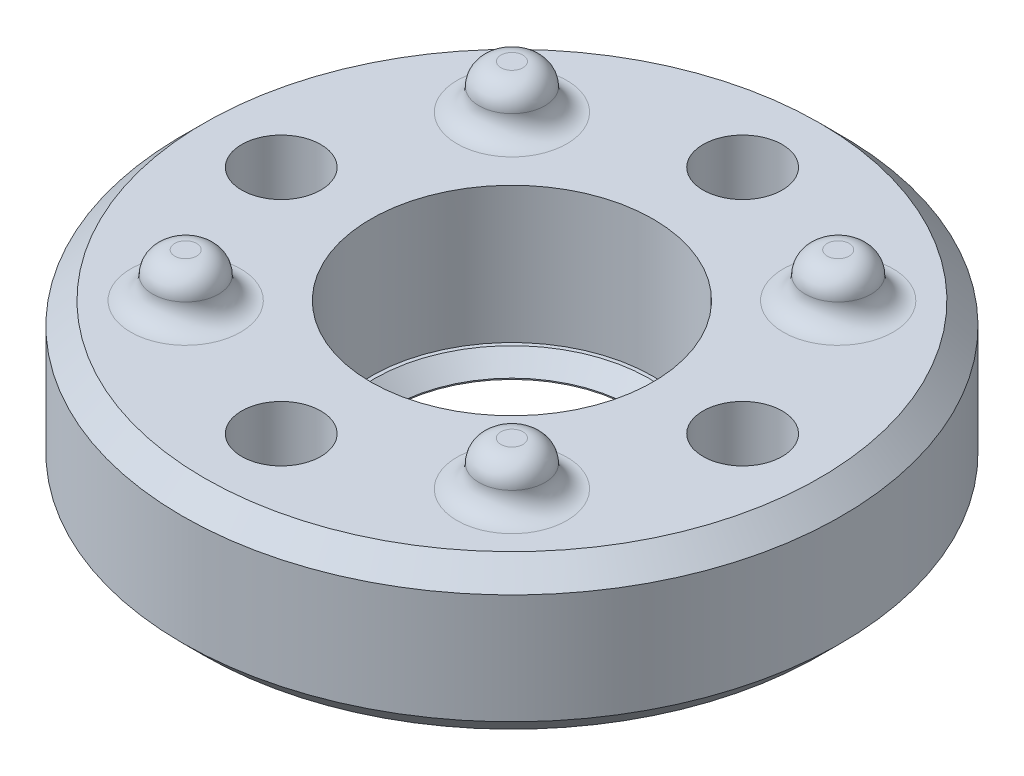
ISO-10303-21;
HEADER;
FILE_DESCRIPTION(('STEP AP214'),'2;1');
FILE_NAME('part.step','',(''),(''),'','','');
FILE_SCHEMA(('AUTOMOTIVE_DESIGN { 1 0 10303 214 1 1 1 1 }'));
ENDSEC;
DATA;
#1=APPLICATION_CONTEXT('core data for automotive mechanical design processes');
#2=APPLICATION_PROTOCOL_DEFINITION('international standard','automotive_design',2000,#1);
#3=PRODUCT_CONTEXT('',#1,'mechanical');
#4=PRODUCT('Part','Part','',(#3));
#5=PRODUCT_RELATED_PRODUCT_CATEGORY('part','',(#4));
#6=PRODUCT_DEFINITION_FORMATION('','',#4);
#7=PRODUCT_DEFINITION_CONTEXT('part definition',#1,'design');
#8=PRODUCT_DEFINITION('design','',#6,#7);
#9=PRODUCT_DEFINITION_SHAPE('','',#8);
#10=(LENGTH_UNIT() NAMED_UNIT(*) SI_UNIT(.MILLI.,.METRE.));
#11=(NAMED_UNIT(*) PLANE_ANGLE_UNIT() SI_UNIT($,.RADIAN.));
#12=(NAMED_UNIT(*) SI_UNIT($,.STERADIAN.) SOLID_ANGLE_UNIT());
#13=UNCERTAINTY_MEASURE_WITH_UNIT(LENGTH_MEASURE(1.E-05),#10,'distance_accuracy_value','');
#14=(GEOMETRIC_REPRESENTATION_CONTEXT(3) GLOBAL_UNCERTAINTY_ASSIGNED_CONTEXT((#13)) GLOBAL_UNIT_ASSIGNED_CONTEXT((#10,
#11,#12)) REPRESENTATION_CONTEXT('',''));
#15=CARTESIAN_POINT('',(0.,0.,0.));
#16=DIRECTION('',(0.,0.,1.));
#17=DIRECTION('',(1.,0.,0.));
#18=AXIS2_PLACEMENT_3D('',#15,#16,#17);
#19=CARTESIAN_POINT('',(0.,7.,0.));
#20=DIRECTION('',(0.,-1.,0.));
#21=DIRECTION('',(0.,0.,-1.));
#22=AXIS2_PLACEMENT_3D('',#19,#20,#21);
#23=CYLINDRICAL_SURFACE('',#22,6.425);
#24=CARTESIAN_POINT('',(0.,7.,0.));
#25=DIRECTION('',(0.,1.,0.));
#26=DIRECTION('',(0.,0.,1.));
#27=AXIS2_PLACEMENT_3D('',#24,#25,#26);
#28=CIRCLE('',#27,6.425);
#29=CARTESIAN_POINT('',(0.,7.,6.425));
#30=VERTEX_POINT('',#29);
#31=EDGE_CURVE('E148',#30,#30,#28,.T.);
#32=ORIENTED_EDGE('',*,*,#31,.T.);
#33=EDGE_LOOP('',(#32));
#34=FACE_BOUND('',#33,.T.);
#35=CARTESIAN_POINT('',(0.,0.8,0.));
#36=DIRECTION('',(0.,-1.,0.));
#37=DIRECTION('',(0.,0.,-1.));
#38=AXIS2_PLACEMENT_3D('',#35,#36,#37);
#39=CIRCLE('',#38,6.425);
#40=CARTESIAN_POINT('',(0.,0.8,-6.425));
#41=VERTEX_POINT('',#40);
#42=EDGE_CURVE('E67',#41,#41,#39,.T.);
#43=ORIENTED_EDGE('',*,*,#42,.T.);
#44=EDGE_LOOP('',(#43));
#45=FACE_BOUND('',#44,.T.);
#46=ADVANCED_FACE('F45',(#34,#45),#23,.F.);
#47=CARTESIAN_POINT('',(-10.5,7.,0.));
#48=DIRECTION('',(0.,-1.,0.));
#49=DIRECTION('',(0.,0.,-1.));
#50=AXIS2_PLACEMENT_3D('',#47,#48,#49);
#51=CYLINDRICAL_SURFACE('',#50,1.8);
#52=CARTESIAN_POINT('',(-10.5,7.,0.));
#53=DIRECTION('',(0.,-1.,0.));
#54=DIRECTION('',(0.,0.,-1.));
#55=AXIS2_PLACEMENT_3D('',#52,#53,#54);
#56=CIRCLE('',#55,1.8);
#57=CARTESIAN_POINT('',(-10.5,7.,-1.8));
#58=VERTEX_POINT('',#57);
#59=EDGE_CURVE('E153',#58,#58,#56,.T.);
#60=ORIENTED_EDGE('',*,*,#59,.F.);
#61=EDGE_LOOP('',(#60));
#62=FACE_BOUND('',#61,.T.);
#63=CARTESIAN_POINT('',(-10.5,2.,0.));
#64=DIRECTION('',(0.,-1.,0.));
#65=DIRECTION('',(0.,0.,-1.));
#66=AXIS2_PLACEMENT_3D('',#63,#64,#65);
#67=CIRCLE('',#66,1.8);
#68=CARTESIAN_POINT('',(-10.5,2.,-1.8));
#69=VERTEX_POINT('',#68);
#70=EDGE_CURVE('E149',#69,#69,#67,.F.);
#71=ORIENTED_EDGE('',*,*,#70,.F.);
#72=EDGE_LOOP('',(#71));
#73=FACE_BOUND('',#72,.T.);
#74=ADVANCED_FACE('F224',(#62,#73),#51,.F.);
#75=CARTESIAN_POINT('',(0.,7.,-10.5));
#76=DIRECTION('',(0.,-1.,0.));
#77=DIRECTION('',(0.,0.,-1.));
#78=AXIS2_PLACEMENT_3D('',#75,#76,#77);
#79=CYLINDRICAL_SURFACE('',#78,1.8);
#80=CARTESIAN_POINT('',(0.,7.,-10.5));
#81=DIRECTION('',(0.,-1.,0.));
#82=DIRECTION('',(0.,0.,-1.));
#83=AXIS2_PLACEMENT_3D('',#80,#81,#82);
#84=CIRCLE('',#83,1.8);
#85=CARTESIAN_POINT('',(0.,7.,-12.3));
#86=VERTEX_POINT('',#85);
#87=EDGE_CURVE('E174',#86,#86,#84,.T.);
#88=ORIENTED_EDGE('',*,*,#87,.F.);
#89=EDGE_LOOP('',(#88));
#90=FACE_BOUND('',#89,.T.);
#91=CARTESIAN_POINT('',(0.,2.,-10.5));
#92=DIRECTION('',(0.,-1.,0.));
#93=DIRECTION('',(0.,0.,-1.));
#94=AXIS2_PLACEMENT_3D('',#91,#92,#93);
#95=CIRCLE('',#94,1.8);
#96=CARTESIAN_POINT('',(0.,2.,-12.3));
#97=VERTEX_POINT('',#96);
#98=EDGE_CURVE('E154',#97,#97,#95,.F.);
#99=ORIENTED_EDGE('',*,*,#98,.F.);
#100=EDGE_LOOP('',(#99));
#101=FACE_BOUND('',#100,.T.);
#102=ADVANCED_FACE('F231',(#90,#101),#79,.F.);
#103=CARTESIAN_POINT('',(10.5,7.,0.));
#104=DIRECTION('',(0.,-1.,0.));
#105=DIRECTION('',(0.,0.,-1.));
#106=AXIS2_PLACEMENT_3D('',#103,#104,#105);
#107=CYLINDRICAL_SURFACE('',#106,1.8);
#108=CARTESIAN_POINT('',(10.5,7.,0.));
#109=DIRECTION('',(0.,-1.,0.));
#110=DIRECTION('',(0.,0.,-1.));
#111=AXIS2_PLACEMENT_3D('',#108,#109,#110);
#112=CIRCLE('',#111,1.8);
#113=CARTESIAN_POINT('',(10.5,7.,-1.8));
#114=VERTEX_POINT('',#113);
#115=EDGE_CURVE('E178',#114,#114,#112,.T.);
#116=ORIENTED_EDGE('',*,*,#115,.F.);
#117=EDGE_LOOP('',(#116));
#118=FACE_BOUND('',#117,.T.);
#119=CARTESIAN_POINT('',(10.5,2.,0.));
#120=DIRECTION('',(0.,-1.,0.));
#121=DIRECTION('',(0.,0.,-1.));
#122=AXIS2_PLACEMENT_3D('',#119,#120,#121);
#123=CIRCLE('',#122,1.8);
#124=CARTESIAN_POINT('',(10.5,2.,-1.8));
#125=VERTEX_POINT('',#124);
#126=EDGE_CURVE('E158',#125,#125,#123,.F.);
#127=ORIENTED_EDGE('',*,*,#126,.F.);
#128=EDGE_LOOP('',(#127));
#129=FACE_BOUND('',#128,.T.);
#130=ADVANCED_FACE('F238',(#118,#129),#107,.F.);
#131=CARTESIAN_POINT('',(0.,7.,10.5));
#132=DIRECTION('',(0.,-1.,0.));
#133=DIRECTION('',(0.,0.,-1.));
#134=AXIS2_PLACEMENT_3D('',#131,#132,#133);
#135=CYLINDRICAL_SURFACE('',#134,1.8);
#136=CARTESIAN_POINT('',(0.,7.,10.5));
#137=DIRECTION('',(0.,-1.,0.));
#138=DIRECTION('',(0.,0.,-1.));
#139=AXIS2_PLACEMENT_3D('',#136,#137,#138);
#140=CIRCLE('',#139,1.8);
#141=CARTESIAN_POINT('',(0.,7.,8.7));
#142=VERTEX_POINT('',#141);
#143=EDGE_CURVE('E170',#142,#142,#140,.T.);
#144=ORIENTED_EDGE('',*,*,#143,.F.);
#145=EDGE_LOOP('',(#144));
#146=FACE_BOUND('',#145,.T.);
#147=CARTESIAN_POINT('',(0.,2.,10.5));
#148=DIRECTION('',(0.,-1.,0.));
#149=DIRECTION('',(0.,0.,-1.));
#150=AXIS2_PLACEMENT_3D('',#147,#148,#149);
#151=CIRCLE('',#150,1.8);
#152=CARTESIAN_POINT('',(0.,2.,8.7));
#153=VERTEX_POINT('',#152);
#154=EDGE_CURVE('E162',#153,#153,#151,.F.);
#155=ORIENTED_EDGE('',*,*,#154,.F.);
#156=EDGE_LOOP('',(#155));
#157=FACE_BOUND('',#156,.T.);
#158=ADVANCED_FACE('F220',(#146,#157),#135,.F.);
#159=CARTESIAN_POINT('',(0.,7.,0.));
#160=DIRECTION('',(0.,1.,0.));
#161=DIRECTION('',(0.,0.,1.));
#162=AXIS2_PLACEMENT_3D('',#159,#160,#161);
#163=PLANE('',#162);
#164=CARTESIAN_POINT('',(-7.42462120245875,7.,-7.42462120245875));
#165=DIRECTION('',(0.,1.,0.));
#166=DIRECTION('',(0.,0.,1.));
#167=AXIS2_PLACEMENT_3D('',#164,#165,#166);
#168=CIRCLE('',#167,2.5);
#169=CARTESIAN_POINT('',(-7.42462120245875,7.,-4.92462120245875));
#170=VERTEX_POINT('',#169);
#171=EDGE_CURVE('E59',#170,#170,#168,.F.);
#172=ORIENTED_EDGE('',*,*,#171,.T.);
#173=EDGE_LOOP('',(#172));
#174=FACE_BOUND('',#173,.T.);
#175=CARTESIAN_POINT('',(-7.42462120245875,7.,7.42462120245875));
#176=DIRECTION('',(0.,1.,0.));
#177=DIRECTION('',(0.,0.,1.));
#178=AXIS2_PLACEMENT_3D('',#175,#176,#177);
#179=CIRCLE('',#178,2.5);
#180=CARTESIAN_POINT('',(-7.42462120245875,7.,9.92462120245875));
#181=VERTEX_POINT('',#180);
#182=EDGE_CURVE('E64',#181,#181,#179,.F.);
#183=ORIENTED_EDGE('',*,*,#182,.T.);
#184=EDGE_LOOP('',(#183));
#185=FACE_BOUND('',#184,.T.);
#186=CARTESIAN_POINT('',(7.42462120245875,7.,-7.42462120245875));
#187=DIRECTION('',(0.,1.,0.));
#188=DIRECTION('',(0.,0.,1.));
#189=AXIS2_PLACEMENT_3D('',#186,#187,#188);
#190=CIRCLE('',#189,2.5);
#191=CARTESIAN_POINT('',(7.42462120245875,7.,-4.92462120245875));
#192=VERTEX_POINT('',#191);
#193=EDGE_CURVE('E92',#192,#192,#190,.F.);
#194=ORIENTED_EDGE('',*,*,#193,.T.);
#195=EDGE_LOOP('',(#194));
#196=FACE_BOUND('',#195,.T.);
#197=CARTESIAN_POINT('',(7.42462120245875,7.,7.42462120245875));
#198=DIRECTION('',(0.,1.,0.));
#199=DIRECTION('',(0.,0.,1.));
#200=AXIS2_PLACEMENT_3D('',#197,#198,#199);
#201=CIRCLE('',#200,2.5);
#202=CARTESIAN_POINT('',(7.42462120245875,7.,9.92462120245875));
#203=VERTEX_POINT('',#202);
#204=EDGE_CURVE('E96',#203,#203,#201,.F.);
#205=ORIENTED_EDGE('',*,*,#204,.T.);
#206=EDGE_LOOP('',(#205));
#207=FACE_BOUND('',#206,.T.);
#208=CARTESIAN_POINT('',(0.,7.,0.));
#209=DIRECTION('',(0.,1.,0.));
#210=DIRECTION('',(0.,0.,1.));
#211=AXIS2_PLACEMENT_3D('',#208,#209,#210);
#212=CIRCLE('',#211,14.);
#213=CARTESIAN_POINT('',(0.,7.,14.));
#214=VERTEX_POINT('',#213);
#215=EDGE_CURVE('E128',#214,#214,#212,.T.);
#216=ORIENTED_EDGE('',*,*,#215,.T.);
#217=EDGE_LOOP('',(#216));
#218=FACE_BOUND('',#217,.T.);
#219=ORIENTED_EDGE('',*,*,#143,.T.);
#220=EDGE_LOOP('',(#219));
#221=FACE_BOUND('',#220,.T.);
#222=ORIENTED_EDGE('',*,*,#115,.T.);
#223=EDGE_LOOP('',(#222));
#224=FACE_BOUND('',#223,.T.);
#225=ORIENTED_EDGE('',*,*,#87,.T.);
#226=EDGE_LOOP('',(#225));
#227=FACE_BOUND('',#226,.T.);
#228=ORIENTED_EDGE('',*,*,#59,.T.);
#229=EDGE_LOOP('',(#228));
#230=FACE_BOUND('',#229,.T.);
#231=ORIENTED_EDGE('',*,*,#31,.F.);
#232=EDGE_LOOP('',(#231));
#233=FACE_BOUND('',#232,.T.);
#234=ADVANCED_FACE('F208',(#174,#185,#196,#207,#218,#221,#224,#227,#230,#233),#163,.T.);
#235=CARTESIAN_POINT('',(0.,0.,0.));
#236=DIRECTION('',(0.,1.,0.));
#237=DIRECTION('',(0.,0.,1.));
#238=AXIS2_PLACEMENT_3D('',#235,#236,#237);
#239=PLANE('',#238);
#240=CARTESIAN_POINT('',(0.,0.,0.));
#241=DIRECTION('',(0.,1.,0.));
#242=DIRECTION('',(0.,0.,1.));
#243=AXIS2_PLACEMENT_3D('',#240,#241,#242);
#244=CIRCLE('',#243,14.);
#245=CARTESIAN_POINT('',(0.,0.,14.));
#246=VERTEX_POINT('',#245);
#247=EDGE_CURVE('E116',#246,#246,#244,.F.);
#248=ORIENTED_EDGE('',*,*,#247,.T.);
#249=EDGE_LOOP('',(#248));
#250=FACE_BOUND('',#249,.T.);
#251=CARTESIAN_POINT('',(0.,0.,10.5));
#252=DIRECTION('',(0.,-1.,0.));
#253=DIRECTION('',(0.,0.,-1.));
#254=AXIS2_PLACEMENT_3D('',#251,#252,#253);
#255=CIRCLE('',#254,3.25);
#256=CARTESIAN_POINT('',(0.,0.,7.25));
#257=VERTEX_POINT('',#256);
#258=EDGE_CURVE('E166',#257,#257,#255,.T.);
#259=ORIENTED_EDGE('',*,*,#258,.F.);
#260=EDGE_LOOP('',(#259));
#261=FACE_BOUND('',#260,.T.);
#262=CARTESIAN_POINT('',(10.5,0.,0.));
#263=DIRECTION('',(0.,-1.,0.));
#264=DIRECTION('',(0.,0.,-1.));
#265=AXIS2_PLACEMENT_3D('',#262,#263,#264);
#266=CIRCLE('',#265,3.25000000000005);
#267=CARTESIAN_POINT('',(10.5,0.,-3.25000000000005));
#268=VERTEX_POINT('',#267);
#269=EDGE_CURVE('E192',#268,#268,#266,.T.);
#270=ORIENTED_EDGE('',*,*,#269,.F.);
#271=EDGE_LOOP('',(#270));
#272=FACE_BOUND('',#271,.T.);
#273=CARTESIAN_POINT('',(0.,0.,-10.5));
#274=DIRECTION('',(0.,-1.,0.));
#275=DIRECTION('',(0.,0.,-1.));
#276=AXIS2_PLACEMENT_3D('',#273,#274,#275);
#277=CIRCLE('',#276,3.25);
#278=CARTESIAN_POINT('',(0.,0.,-13.75));
#279=VERTEX_POINT('',#278);
#280=EDGE_CURVE('E188',#279,#279,#277,.T.);
#281=ORIENTED_EDGE('',*,*,#280,.F.);
#282=EDGE_LOOP('',(#281));
#283=FACE_BOUND('',#282,.T.);
#284=CARTESIAN_POINT('',(-10.5,0.,0.));
#285=DIRECTION('',(0.,-1.,0.));
#286=DIRECTION('',(0.,0.,-1.));
#287=AXIS2_PLACEMENT_3D('',#284,#285,#286);
#288=CIRCLE('',#287,3.25);
#289=CARTESIAN_POINT('',(-10.5,0.,-3.25));
#290=VERTEX_POINT('',#289);
#291=EDGE_CURVE('E87',#290,#290,#288,.T.);
#292=ORIENTED_EDGE('',*,*,#291,.F.);
#293=EDGE_LOOP('',(#292));
#294=FACE_BOUND('',#293,.T.);
#295=CARTESIAN_POINT('',(0.,0.,0.));
#296=DIRECTION('',(0.,-1.,0.));
#297=DIRECTION('',(0.,0.,-1.));
#298=AXIS2_PLACEMENT_3D('',#295,#296,#297);
#299=CIRCLE('',#298,5.5);
#300=CARTESIAN_POINT('',(0.,0.,-5.5));
#301=VERTEX_POINT('',#300);
#302=EDGE_CURVE('E72',#301,#301,#299,.T.);
#303=ORIENTED_EDGE('',*,*,#302,.F.);
#304=EDGE_LOOP('',(#303));
#305=FACE_BOUND('',#304,.T.);
#306=ADVANCED_FACE('F205',(#250,#261,#272,#283,#294,#305),#239,.F.);
#307=CARTESIAN_POINT('',(0.,7.,0.));
#308=DIRECTION('',(0.,-1.,0.));
#309=DIRECTION('',(0.,0.,-1.));
#310=AXIS2_PLACEMENT_3D('',#307,#308,#309);
#311=CYLINDRICAL_SURFACE('',#310,15.);
#312=CARTESIAN_POINT('',(0.,1.00000000000001,0.));
#313=DIRECTION('',(0.,1.,0.));
#314=DIRECTION('',(0.,0.,1.));
#315=AXIS2_PLACEMENT_3D('',#312,#313,#314);
#316=CIRCLE('',#315,15.);
#317=CARTESIAN_POINT('',(0.,1.00000000000001,15.));
#318=VERTEX_POINT('',#317);
#319=EDGE_CURVE('E120',#318,#318,#316,.T.);
#320=ORIENTED_EDGE('',*,*,#319,.T.);
#321=EDGE_LOOP('',(#320));
#322=FACE_BOUND('',#321,.T.);
#323=CARTESIAN_POINT('',(0.,6.,0.));
#324=DIRECTION('',(0.,1.,0.));
#325=DIRECTION('',(0.,0.,1.));
#326=AXIS2_PLACEMENT_3D('',#323,#324,#325);
#327=CIRCLE('',#326,15.);
#328=CARTESIAN_POINT('',(0.,6.,15.));
#329=VERTEX_POINT('',#328);
#330=EDGE_CURVE('E124',#329,#329,#327,.F.);
#331=ORIENTED_EDGE('',*,*,#330,.T.);
#332=EDGE_LOOP('',(#331));
#333=FACE_BOUND('',#332,.T.);
#334=ADVANCED_FACE('F207',(#322,#333),#311,.T.);
#335=CARTESIAN_POINT('',(0.,2.,10.5));
#336=DIRECTION('',(0.,-1.,0.));
#337=DIRECTION('',(0.,0.,-1.));
#338=AXIS2_PLACEMENT_3D('',#335,#336,#337);
#339=CYLINDRICAL_SURFACE('',#338,3.25);
#340=CARTESIAN_POINT('',(0.,0.500833564943505,10.5));
#341=DIRECTION('',(0.,1.,0.));
#342=DIRECTION('',(0.,0.,1.));
#343=AXIS2_PLACEMENT_3D('',#340,#341,#342);
#344=CIRCLE('',#343,3.25);
#345=CARTESIAN_POINT('',(0.,0.500833564943505,13.75));
#346=VERTEX_POINT('',#345);
#347=EDGE_CURVE('E132',#346,#346,#344,.T.);
#348=ORIENTED_EDGE('',*,*,#347,.T.);
#349=EDGE_LOOP('',(#348));
#350=FACE_BOUND('',#349,.T.);
#351=ORIENTED_EDGE('',*,*,#258,.T.);
#352=EDGE_LOOP('',(#351));
#353=FACE_BOUND('',#352,.T.);
#354=ADVANCED_FACE('F216',(#350,#353),#339,.F.);
#355=CARTESIAN_POINT('',(10.5,2.,0.));
#356=DIRECTION('',(0.,-1.,0.));
#357=DIRECTION('',(0.,0.,-1.));
#358=AXIS2_PLACEMENT_3D('',#355,#356,#357);
#359=CYLINDRICAL_SURFACE('',#358,3.25000000000005);
#360=CARTESIAN_POINT('',(10.5,0.500833564943503,0.));
#361=DIRECTION('',(0.,1.,0.));
#362=DIRECTION('',(0.,0.,1.));
#363=AXIS2_PLACEMENT_3D('',#360,#361,#362);
#364=CIRCLE('',#363,3.25000000000005);
#365=CARTESIAN_POINT('',(10.5,0.500833564943503,3.25000000000005));
#366=VERTEX_POINT('',#365);
#367=EDGE_CURVE('E136',#366,#366,#364,.T.);
#368=ORIENTED_EDGE('',*,*,#367,.T.);
#369=EDGE_LOOP('',(#368));
#370=FACE_BOUND('',#369,.T.);
#371=ORIENTED_EDGE('',*,*,#269,.T.);
#372=EDGE_LOOP('',(#371));
#373=FACE_BOUND('',#372,.T.);
#374=ADVANCED_FACE('F254',(#370,#373),#359,.F.);
#375=CARTESIAN_POINT('',(0.,2.,-10.5));
#376=DIRECTION('',(0.,-1.,0.));
#377=DIRECTION('',(0.,0.,-1.));
#378=AXIS2_PLACEMENT_3D('',#375,#376,#377);
#379=CYLINDRICAL_SURFACE('',#378,3.25);
#380=CARTESIAN_POINT('',(0.,0.500833564943505,-10.5));
#381=DIRECTION('',(0.,1.,0.));
#382=DIRECTION('',(0.,0.,1.));
#383=AXIS2_PLACEMENT_3D('',#380,#381,#382);
#384=CIRCLE('',#383,3.25);
#385=CARTESIAN_POINT('',(0.,0.500833564943505,-7.25));
#386=VERTEX_POINT('',#385);
#387=EDGE_CURVE('E140',#386,#386,#384,.T.);
#388=ORIENTED_EDGE('',*,*,#387,.T.);
#389=EDGE_LOOP('',(#388));
#390=FACE_BOUND('',#389,.T.);
#391=ORIENTED_EDGE('',*,*,#280,.T.);
#392=EDGE_LOOP('',(#391));
#393=FACE_BOUND('',#392,.T.);
#394=ADVANCED_FACE('F250',(#390,#393),#379,.F.);
#395=CARTESIAN_POINT('',(-10.5,2.,0.));
#396=DIRECTION('',(0.,-1.,0.));
#397=DIRECTION('',(0.,0.,-1.));
#398=AXIS2_PLACEMENT_3D('',#395,#396,#397);
#399=CYLINDRICAL_SURFACE('',#398,3.25);
#400=CARTESIAN_POINT('',(-10.5,0.500833564943505,0.));
#401=DIRECTION('',(0.,1.,0.));
#402=DIRECTION('',(0.,0.,1.));
#403=AXIS2_PLACEMENT_3D('',#400,#401,#402);
#404=CIRCLE('',#403,3.25);
#405=CARTESIAN_POINT('',(-10.5,0.500833564943505,3.25));
#406=VERTEX_POINT('',#405);
#407=EDGE_CURVE('E144',#406,#406,#404,.T.);
#408=ORIENTED_EDGE('',*,*,#407,.T.);
#409=EDGE_LOOP('',(#408));
#410=FACE_BOUND('',#409,.T.);
#411=ORIENTED_EDGE('',*,*,#291,.T.);
#412=EDGE_LOOP('',(#411));
#413=FACE_BOUND('',#412,.T.);
#414=ADVANCED_FACE('F246',(#410,#413),#399,.F.);
#415=CARTESIAN_POINT('',(-10.5,0.500833564943505,0.));
#416=DIRECTION('',(0.,1.,0.));
#417=DIRECTION('',(0.,0.,1.));
#418=AXIS2_PLACEMENT_3D('',#415,#416,#417);
#419=TOROIDAL_SURFACE('',#418,1.75,1.5);
#420=ORIENTED_EDGE('',*,*,#407,.F.);
#421=EDGE_LOOP('',(#420));
#422=FACE_BOUND('',#421,.T.);
#423=ORIENTED_EDGE('',*,*,#70,.T.);
#424=EDGE_LOOP('',(#423));
#425=FACE_BOUND('',#424,.T.);
#426=ADVANCED_FACE('F249',(#422,#425),#419,.F.);
#427=CARTESIAN_POINT('',(0.,0.500833564943505,-10.5));
#428=DIRECTION('',(0.,1.,0.));
#429=DIRECTION('',(0.,0.,1.));
#430=AXIS2_PLACEMENT_3D('',#427,#428,#429);
#431=TOROIDAL_SURFACE('',#430,1.75,1.5);
#432=ORIENTED_EDGE('',*,*,#387,.F.);
#433=EDGE_LOOP('',(#432));
#434=FACE_BOUND('',#433,.T.);
#435=ORIENTED_EDGE('',*,*,#98,.T.);
#436=EDGE_LOOP('',(#435));
#437=FACE_BOUND('',#436,.T.);
#438=ADVANCED_FACE('F453',(#434,#437),#431,.F.);
#439=CARTESIAN_POINT('',(10.5,0.500833564943503,0.));
#440=DIRECTION('',(0.,1.,0.));
#441=DIRECTION('',(0.,0.,1.));
#442=AXIS2_PLACEMENT_3D('',#439,#440,#441);
#443=TOROIDAL_SURFACE('',#442,1.75000000000005,1.5);
#444=ORIENTED_EDGE('',*,*,#367,.F.);
#445=EDGE_LOOP('',(#444));
#446=FACE_BOUND('',#445,.T.);
#447=ORIENTED_EDGE('',*,*,#126,.T.);
#448=EDGE_LOOP('',(#447));
#449=FACE_BOUND('',#448,.T.);
#450=ADVANCED_FACE('F443',(#446,#449),#443,.F.);
#451=CARTESIAN_POINT('',(0.,0.500833564943505,10.5));
#452=DIRECTION('',(0.,1.,0.));
#453=DIRECTION('',(0.,0.,1.));
#454=AXIS2_PLACEMENT_3D('',#451,#452,#453);
#455=TOROIDAL_SURFACE('',#454,1.75,1.5);
#456=ORIENTED_EDGE('',*,*,#347,.F.);
#457=EDGE_LOOP('',(#456));
#458=FACE_BOUND('',#457,.T.);
#459=ORIENTED_EDGE('',*,*,#154,.T.);
#460=EDGE_LOOP('',(#459));
#461=FACE_BOUND('',#460,.T.);
#462=ADVANCED_FACE('F433',(#458,#461),#455,.F.);
#463=CARTESIAN_POINT('',(0.,7.,0.));
#464=DIRECTION('',(0.,-1.,0.));
#465=DIRECTION('',(0.,0.,-1.));
#466=AXIS2_PLACEMENT_3D('',#463,#464,#465);
#467=CONICAL_SURFACE('',#466,14.,0.785398163397447);
#468=ORIENTED_EDGE('',*,*,#330,.F.);
#469=EDGE_LOOP('',(#468));
#470=FACE_BOUND('',#469,.T.);
#471=ORIENTED_EDGE('',*,*,#215,.F.);
#472=EDGE_LOOP('',(#471));
#473=FACE_BOUND('',#472,.T.);
#474=ADVANCED_FACE('F423',(#470,#473),#467,.T.);
#475=CARTESIAN_POINT('',(0.,1.00000000000001,0.));
#476=DIRECTION('',(0.,1.,0.));
#477=DIRECTION('',(0.,0.,1.));
#478=AXIS2_PLACEMENT_3D('',#475,#476,#477);
#479=CONICAL_SURFACE('',#478,15.,0.785398163397448);
#480=ORIENTED_EDGE('',*,*,#247,.F.);
#481=EDGE_LOOP('',(#480));
#482=FACE_BOUND('',#481,.T.);
#483=ORIENTED_EDGE('',*,*,#319,.F.);
#484=EDGE_LOOP('',(#483));
#485=FACE_BOUND('',#484,.T.);
#486=ADVANCED_FACE('F266',(#482,#485),#479,.T.);
#487=CARTESIAN_POINT('',(7.42462120245875,9.,-7.42462120245875));
#488=DIRECTION('',(0.,1.,0.));
#489=DIRECTION('',(0.,0.,1.));
#490=AXIS2_PLACEMENT_3D('',#487,#488,#489);
#491=PLANE('',#490);
#492=CARTESIAN_POINT('',(7.42462120245875,9.,-7.42462120245875));
#493=DIRECTION('',(0.,1.,0.));
#494=DIRECTION('',(0.,0.,1.));
#495=AXIS2_PLACEMENT_3D('',#492,#493,#494);
#496=CIRCLE('',#495,0.500000000000001);
#497=CARTESIAN_POINT('',(7.42462120245875,9.,-6.92462120245875));
#498=VERTEX_POINT('',#497);
#499=EDGE_CURVE('E108',#498,#498,#496,.T.);
#500=ORIENTED_EDGE('',*,*,#499,.T.);
#501=EDGE_LOOP('',(#500));
#502=FACE_BOUND('',#501,.T.);
#503=ADVANCED_FACE('F262',(#502),#491,.T.);
#504=CARTESIAN_POINT('',(7.42462120245875,9.,7.42462120245875));
#505=DIRECTION('',(0.,1.,0.));
#506=DIRECTION('',(0.,0.,1.));
#507=AXIS2_PLACEMENT_3D('',#504,#505,#506);
#508=PLANE('',#507);
#509=CARTESIAN_POINT('',(7.42462120245875,9.,7.42462120245875));
#510=DIRECTION('',(0.,1.,0.));
#511=DIRECTION('',(0.,0.,1.));
#512=AXIS2_PLACEMENT_3D('',#509,#510,#511);
#513=CIRCLE('',#512,0.500000000000002);
#514=CARTESIAN_POINT('',(7.42462120245875,9.,7.92462120245875));
#515=VERTEX_POINT('',#514);
#516=EDGE_CURVE('E112',#515,#515,#513,.T.);
#517=ORIENTED_EDGE('',*,*,#516,.T.);
#518=EDGE_LOOP('',(#517));
#519=FACE_BOUND('',#518,.T.);
#520=ADVANCED_FACE('F265',(#519),#508,.T.);
#521=CARTESIAN_POINT('',(-7.42462120245875,9.,7.42462120245875));
#522=DIRECTION('',(0.,1.,0.));
#523=DIRECTION('',(0.,0.,1.));
#524=AXIS2_PLACEMENT_3D('',#521,#522,#523);
#525=PLANE('',#524);
#526=CARTESIAN_POINT('',(-7.42462120245875,9.,7.42462120245875));
#527=DIRECTION('',(0.,1.,0.));
#528=DIRECTION('',(0.,0.,1.));
#529=AXIS2_PLACEMENT_3D('',#526,#527,#528);
#530=CIRCLE('',#529,0.499999999999999);
#531=CARTESIAN_POINT('',(-7.42462120245875,9.,7.92462120245875));
#532=VERTEX_POINT('',#531);
#533=EDGE_CURVE('E104',#532,#532,#530,.T.);
#534=ORIENTED_EDGE('',*,*,#533,.T.);
#535=EDGE_LOOP('',(#534));
#536=FACE_BOUND('',#535,.T.);
#537=ADVANCED_FACE('F270',(#536),#525,.T.);
#538=CARTESIAN_POINT('',(-7.42462120245875,9.,-7.42462120245875));
#539=DIRECTION('',(0.,1.,0.));
#540=DIRECTION('',(0.,0.,1.));
#541=AXIS2_PLACEMENT_3D('',#538,#539,#540);
#542=PLANE('',#541);
#543=CARTESIAN_POINT('',(-7.42462120245875,9.,-7.42462120245875));
#544=DIRECTION('',(0.,1.,0.));
#545=DIRECTION('',(0.,0.,1.));
#546=AXIS2_PLACEMENT_3D('',#543,#544,#545);
#547=CIRCLE('',#546,0.500000000000001);
#548=CARTESIAN_POINT('',(-7.42462120245875,9.,-6.92462120245875));
#549=VERTEX_POINT('',#548);
#550=EDGE_CURVE('E100',#549,#549,#547,.T.);
#551=ORIENTED_EDGE('',*,*,#550,.T.);
#552=EDGE_LOOP('',(#551));
#553=FACE_BOUND('',#552,.T.);
#554=ADVANCED_FACE('F274',(#553),#542,.T.);
#555=CARTESIAN_POINT('',(7.42462120245875,8.,7.42462120245875));
#556=DIRECTION('',(0.,1.,0.));
#557=DIRECTION('',(0.,0.,1.));
#558=AXIS2_PLACEMENT_3D('',#555,#556,#557);
#559=TOROIDAL_SURFACE('',#558,2.5,1.);
#560=ORIENTED_EDGE('',*,*,#204,.F.);
#561=EDGE_LOOP('',(#560));
#562=FACE_BOUND('',#561,.T.);
#563=CARTESIAN_POINT('',(7.42462120245875,8.,7.42462120245875));
#564=DIRECTION('',(0.,1.,0.));
#565=DIRECTION('',(0.,0.,1.));
#566=AXIS2_PLACEMENT_3D('',#563,#564,#565);
#567=CIRCLE('',#566,1.5);
#568=CARTESIAN_POINT('',(7.42462120245875,8.,8.92462120245875));
#569=VERTEX_POINT('',#568);
#570=EDGE_CURVE('E84',#569,#569,#567,.T.);
#571=ORIENTED_EDGE('',*,*,#570,.F.);
#572=EDGE_LOOP('',(#571));
#573=FACE_BOUND('',#572,.T.);
#574=ADVANCED_FACE('F278',(#562,#573),#559,.F.);
#575=CARTESIAN_POINT('',(7.42462120245875,8.,7.42462120245875));
#576=DIRECTION('',(0.,1.,0.));
#577=DIRECTION('',(0.,0.,1.));
#578=AXIS2_PLACEMENT_3D('',#575,#576,#577);
#579=DEGENERATE_TOROIDAL_SURFACE('',#578,0.500000000000002,1.,.T.);
#580=ORIENTED_EDGE('',*,*,#570,.T.);
#581=EDGE_LOOP('',(#580));
#582=FACE_BOUND('',#581,.T.);
#583=ORIENTED_EDGE('',*,*,#516,.F.);
#584=EDGE_LOOP('',(#583));
#585=FACE_BOUND('',#584,.T.);
#586=ADVANCED_FACE('F371',(#582,#585),#579,.T.);
#587=CARTESIAN_POINT('',(7.42462120245875,8.,-7.42462120245875));
#588=DIRECTION('',(0.,1.,0.));
#589=DIRECTION('',(0.,0.,1.));
#590=AXIS2_PLACEMENT_3D('',#587,#588,#589);
#591=TOROIDAL_SURFACE('',#590,2.5,1.);
#592=ORIENTED_EDGE('',*,*,#193,.F.);
#593=EDGE_LOOP('',(#592));
#594=FACE_BOUND('',#593,.T.);
#595=CARTESIAN_POINT('',(7.42462120245875,8.,-7.42462120245875));
#596=DIRECTION('',(0.,1.,0.));
#597=DIRECTION('',(0.,0.,1.));
#598=AXIS2_PLACEMENT_3D('',#595,#596,#597);
#599=CIRCLE('',#598,1.5);
#600=CARTESIAN_POINT('',(7.42462120245875,8.,-5.92462120245875));
#601=VERTEX_POINT('',#600);
#602=EDGE_CURVE('E80',#601,#601,#599,.T.);
#603=ORIENTED_EDGE('',*,*,#602,.F.);
#604=EDGE_LOOP('',(#603));
#605=FACE_BOUND('',#604,.T.);
#606=ADVANCED_FACE('F361',(#594,#605),#591,.F.);
#607=CARTESIAN_POINT('',(7.42462120245875,8.,-7.42462120245875));
#608=DIRECTION('',(0.,1.,0.));
#609=DIRECTION('',(0.,0.,1.));
#610=AXIS2_PLACEMENT_3D('',#607,#608,#609);
#611=DEGENERATE_TOROIDAL_SURFACE('',#610,0.500000000000001,1.,.T.);
#612=ORIENTED_EDGE('',*,*,#602,.T.);
#613=EDGE_LOOP('',(#612));
#614=FACE_BOUND('',#613,.T.);
#615=ORIENTED_EDGE('',*,*,#499,.F.);
#616=EDGE_LOOP('',(#615));
#617=FACE_BOUND('',#616,.T.);
#618=ADVANCED_FACE('F351',(#614,#617),#611,.T.);
#619=CARTESIAN_POINT('',(-7.42462120245875,8.,7.42462120245875));
#620=DIRECTION('',(0.,1.,0.));
#621=DIRECTION('',(0.,0.,1.));
#622=AXIS2_PLACEMENT_3D('',#619,#620,#621);
#623=TOROIDAL_SURFACE('',#622,2.5,1.);
#624=ORIENTED_EDGE('',*,*,#182,.F.);
#625=EDGE_LOOP('',(#624));
#626=FACE_BOUND('',#625,.T.);
#627=CARTESIAN_POINT('',(-7.42462120245875,8.,7.42462120245875));
#628=DIRECTION('',(0.,1.,0.));
#629=DIRECTION('',(0.,0.,1.));
#630=AXIS2_PLACEMENT_3D('',#627,#628,#629);
#631=CIRCLE('',#630,1.5);
#632=CARTESIAN_POINT('',(-7.42462120245875,8.,8.92462120245875));
#633=VERTEX_POINT('',#632);
#634=EDGE_CURVE('E76',#633,#633,#631,.T.);
#635=ORIENTED_EDGE('',*,*,#634,.F.);
#636=EDGE_LOOP('',(#635));
#637=FACE_BOUND('',#636,.T.);
#638=ADVANCED_FACE('F341',(#626,#637),#623,.F.);
#639=CARTESIAN_POINT('',(-7.42462120245875,8.,7.42462120245875));
#640=DIRECTION('',(0.,1.,0.));
#641=DIRECTION('',(0.,0.,1.));
#642=AXIS2_PLACEMENT_3D('',#639,#640,#641);
#643=DEGENERATE_TOROIDAL_SURFACE('',#642,0.499999999999999,1.,.T.);
#644=ORIENTED_EDGE('',*,*,#634,.T.);
#645=EDGE_LOOP('',(#644));
#646=FACE_BOUND('',#645,.T.);
#647=ORIENTED_EDGE('',*,*,#533,.F.);
#648=EDGE_LOOP('',(#647));
#649=FACE_BOUND('',#648,.T.);
#650=ADVANCED_FACE('F332',(#646,#649),#643,.T.);
#651=CARTESIAN_POINT('',(-7.42462120245875,8.,-7.42462120245875));
#652=DIRECTION('',(0.,1.,0.));
#653=DIRECTION('',(0.,0.,1.));
#654=AXIS2_PLACEMENT_3D('',#651,#652,#653);
#655=TOROIDAL_SURFACE('',#654,2.5,1.);
#656=ORIENTED_EDGE('',*,*,#171,.F.);
#657=EDGE_LOOP('',(#656));
#658=FACE_BOUND('',#657,.T.);
#659=CARTESIAN_POINT('',(-7.42462120245875,8.,-7.42462120245875));
#660=DIRECTION('',(0.,1.,0.));
#661=DIRECTION('',(0.,0.,1.));
#662=AXIS2_PLACEMENT_3D('',#659,#660,#661);
#663=CIRCLE('',#662,1.5);
#664=CARTESIAN_POINT('',(-7.42462120245875,8.,-5.92462120245875));
#665=VERTEX_POINT('',#664);
#666=EDGE_CURVE('E71',#665,#665,#663,.T.);
#667=ORIENTED_EDGE('',*,*,#666,.F.);
#668=EDGE_LOOP('',(#667));
#669=FACE_BOUND('',#668,.T.);
#670=ADVANCED_FACE('F322',(#658,#669),#655,.F.);
#671=CARTESIAN_POINT('',(-7.42462120245875,8.,-7.42462120245875));
#672=DIRECTION('',(0.,1.,0.));
#673=DIRECTION('',(0.,0.,1.));
#674=AXIS2_PLACEMENT_3D('',#671,#672,#673);
#675=DEGENERATE_TOROIDAL_SURFACE('',#674,0.500000000000001,1.,.T.);
#676=ORIENTED_EDGE('',*,*,#666,.T.);
#677=EDGE_LOOP('',(#676));
#678=FACE_BOUND('',#677,.T.);
#679=ORIENTED_EDGE('',*,*,#550,.F.);
#680=EDGE_LOOP('',(#679));
#681=FACE_BOUND('',#680,.T.);
#682=ADVANCED_FACE('F282',(#678,#681),#675,.T.);
#683=CARTESIAN_POINT('',(0.,0.8,0.));
#684=DIRECTION('',(0.,-1.,0.));
#685=DIRECTION('',(0.,0.,-1.));
#686=AXIS2_PLACEMENT_3D('',#683,#684,#685);
#687=PLANE('',#686);
#688=CARTESIAN_POINT('',(0.,0.8,0.));
#689=DIRECTION('',(0.,-1.,0.));
#690=DIRECTION('',(0.,0.,-1.));
#691=AXIS2_PLACEMENT_3D('',#688,#689,#690);
#692=CIRCLE('',#691,6.25);
#693=CARTESIAN_POINT('',(0.,0.8,-6.25));
#694=VERTEX_POINT('',#693);
#695=EDGE_CURVE('E54',#694,#694,#692,.T.);
#696=ORIENTED_EDGE('',*,*,#695,.T.);
#697=EDGE_LOOP('',(#696));
#698=FACE_BOUND('',#697,.T.);
#699=ORIENTED_EDGE('',*,*,#42,.F.);
#700=EDGE_LOOP('',(#699));
#701=FACE_BOUND('',#700,.T.);
#702=ADVANCED_FACE('F280',(#698,#701),#687,.F.);
#703=CARTESIAN_POINT('',(0.,0.8,0.));
#704=DIRECTION('',(0.,-1.,0.));
#705=DIRECTION('',(0.,0.,-1.));
#706=AXIS2_PLACEMENT_3D('',#703,#704,#705);
#707=CYLINDRICAL_SURFACE('',#706,5.5);
#708=CARTESIAN_POINT('',(0.,0.0499999999999994,0.));
#709=DIRECTION('',(0.,-1.,0.));
#710=DIRECTION('',(0.,0.,-1.));
#711=AXIS2_PLACEMENT_3D('',#708,#709,#710);
#712=CIRCLE('',#711,5.5);
#713=CARTESIAN_POINT('',(0.,0.0499999999999994,-5.5));
#714=VERTEX_POINT('',#713);
#715=EDGE_CURVE('E10',#714,#714,#712,.F.);
#716=ORIENTED_EDGE('',*,*,#715,.T.);
#717=EDGE_LOOP('',(#716));
#718=FACE_BOUND('',#717,.T.);
#719=ORIENTED_EDGE('',*,*,#302,.T.);
#720=EDGE_LOOP('',(#719));
#721=FACE_BOUND('',#720,.T.);
#722=ADVANCED_FACE('F203',(#718,#721),#707,.F.);
#723=CARTESIAN_POINT('',(0.,0.8,0.));
#724=DIRECTION('',(0.,1.,0.));
#725=DIRECTION('',(0.,0.,1.));
#726=AXIS2_PLACEMENT_3D('',#723,#724,#725);
#727=CONICAL_SURFACE('',#726,6.25,0.785398163397445);
#728=ORIENTED_EDGE('',*,*,#715,.F.);
#729=EDGE_LOOP('',(#728));
#730=FACE_BOUND('',#729,.T.);
#731=ORIENTED_EDGE('',*,*,#695,.F.);
#732=EDGE_LOOP('',(#731));
#733=FACE_BOUND('',#732,.T.);
#734=ADVANCED_FACE('F48',(#730,#733),#727,.F.);
#735=CLOSED_SHELL('',(#46,#74,#102,#130,#158,#234,#306,#334,#354,#374,#394,#414,#426,#438,#450,
#462,#474,#486,#503,#520,#537,#554,#574,#586,#606,#618,#638,#650,#670,#682,#702,#722,#734));
#736=MANIFOLD_SOLID_BREP('B2',#735);
#737=ADVANCED_BREP_SHAPE_REPRESENTATION('',(#18,#736),#14);
#738=SHAPE_DEFINITION_REPRESENTATION(#9,#737);
ENDSEC;
END-ISO-10303-21;
